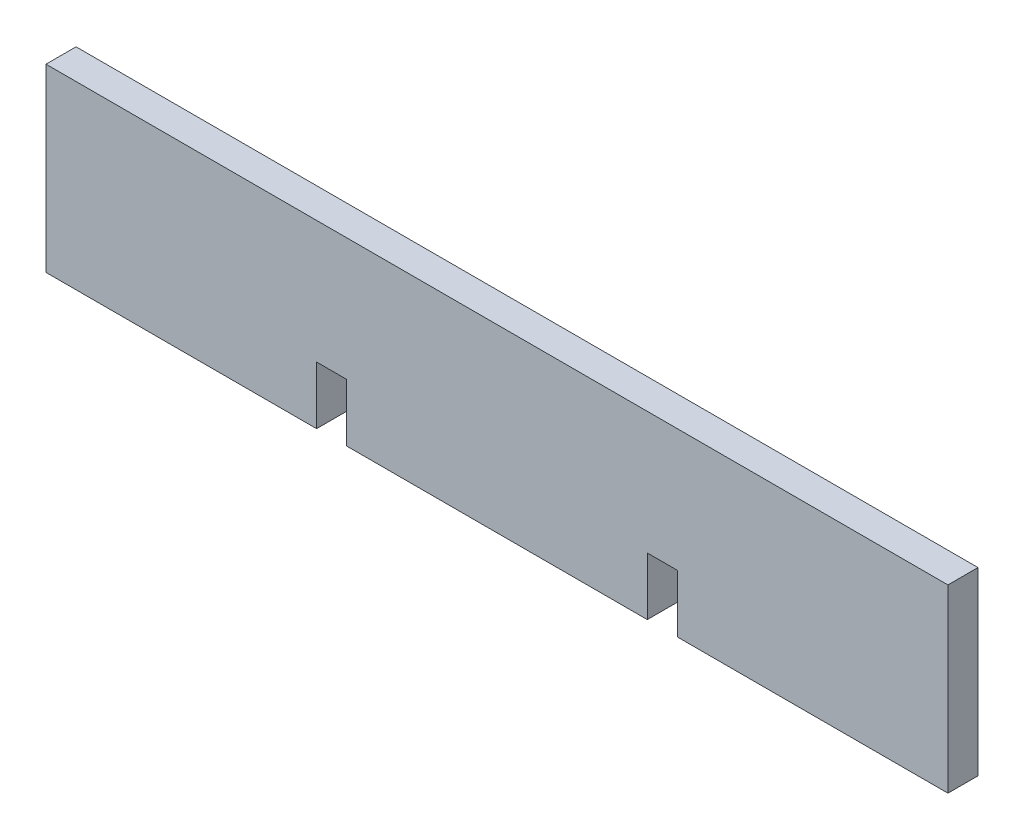
ISO-10303-21;
HEADER;
FILE_DESCRIPTION(('STEP AP214'),'2;1');
FILE_NAME('part.step','',(''),(''),'','','');
FILE_SCHEMA(('AUTOMOTIVE_DESIGN { 1 0 10303 214 1 1 1 1 }'));
ENDSEC;
DATA;
#1=APPLICATION_CONTEXT('core data for automotive mechanical design processes');
#2=APPLICATION_PROTOCOL_DEFINITION('international standard','automotive_design',2000,#1);
#3=PRODUCT_CONTEXT('',#1,'mechanical');
#4=PRODUCT('Part','Part','',(#3));
#5=PRODUCT_RELATED_PRODUCT_CATEGORY('part','',(#4));
#6=PRODUCT_DEFINITION_FORMATION('','',#4);
#7=PRODUCT_DEFINITION_CONTEXT('part definition',#1,'design');
#8=PRODUCT_DEFINITION('design','',#6,#7);
#9=PRODUCT_DEFINITION_SHAPE('','',#8);
#10=(LENGTH_UNIT() NAMED_UNIT(*) SI_UNIT(.MILLI.,.METRE.));
#11=(NAMED_UNIT(*) PLANE_ANGLE_UNIT() SI_UNIT($,.RADIAN.));
#12=(NAMED_UNIT(*) SI_UNIT($,.STERADIAN.) SOLID_ANGLE_UNIT());
#13=UNCERTAINTY_MEASURE_WITH_UNIT(LENGTH_MEASURE(1.E-05),#10,'distance_accuracy_value','');
#14=(GEOMETRIC_REPRESENTATION_CONTEXT(3) GLOBAL_UNCERTAINTY_ASSIGNED_CONTEXT((#13)) GLOBAL_UNIT_ASSIGNED_CONTEXT((#10,
#11,#12)) REPRESENTATION_CONTEXT('',''));
#15=CARTESIAN_POINT('',(0.,0.,0.));
#16=DIRECTION('',(0.,0.,1.));
#17=DIRECTION('',(1.,0.,0.));
#18=AXIS2_PLACEMENT_3D('',#15,#16,#17);
#19=CARTESIAN_POINT('',(334.481177096897,-114.977779473199,10.));
#20=DIRECTION('',(0.,-1.,0.));
#21=DIRECTION('',(0.,0.,-1.));
#22=AXIS2_PLACEMENT_3D('',#19,#20,#21);
#23=PLANE('',#22);
#24=DIRECTION('',(-1.,0.,0.));
#25=VECTOR('',#24,1.);
#26=CARTESIAN_POINT('',(334.481177096897,-114.977779473199,0.));
#27=LINE('',#26,#25);
#28=CARTESIAN_POINT('',(334.481177096897,-114.977779473199,0.));
#29=VERTEX_POINT('',#28);
#30=CARTESIAN_POINT('',(34.4811855740017,-114.977779473199,0.));
#31=VERTEX_POINT('',#30);
#32=EDGE_CURVE('E163',#29,#31,#27,.T.);
#33=ORIENTED_EDGE('',*,*,#32,.T.);
#34=DIRECTION('',(0.,0.,-1.));
#35=VECTOR('',#34,1.);
#36=CARTESIAN_POINT('',(34.4811855740017,-114.977779473199,10.));
#37=LINE('',#36,#35);
#38=CARTESIAN_POINT('',(34.4811855740017,-114.977779473199,10.));
#39=VERTEX_POINT('',#38);
#40=EDGE_CURVE('E11',#39,#31,#37,.T.);
#41=ORIENTED_EDGE('',*,*,#40,.F.);
#42=DIRECTION('',(-1.,0.,0.));
#43=VECTOR('',#42,1.);
#44=CARTESIAN_POINT('',(334.481177096897,-114.977779473199,10.));
#45=LINE('',#44,#43);
#46=CARTESIAN_POINT('',(334.481177096897,-114.977779473199,10.));
#47=VERTEX_POINT('',#46);
#48=EDGE_CURVE('E191',#47,#39,#45,.T.);
#49=ORIENTED_EDGE('',*,*,#48,.F.);
#50=DIRECTION('',(0.,0.,-1.));
#51=VECTOR('',#50,1.);
#52=CARTESIAN_POINT('',(334.481177096897,-114.977779473199,10.));
#53=LINE('',#52,#51);
#54=EDGE_CURVE('E159',#47,#29,#53,.T.);
#55=ORIENTED_EDGE('',*,*,#54,.T.);
#56=EDGE_LOOP('',(#33,#41,#49,#55));
#57=FACE_BOUND('',#56,.T.);
#58=ADVANCED_FACE('F32',(#57),#23,.F.);
#59=CARTESIAN_POINT('',(34.4811855740017,-114.977779473199,10.));
#60=DIRECTION('',(1.,0.,0.));
#61=DIRECTION('',(0.,0.,-1.));
#62=AXIS2_PLACEMENT_3D('',#59,#60,#61);
#63=PLANE('',#62);
#64=DIRECTION('',(0.,-1.,0.));
#65=VECTOR('',#64,1.);
#66=CARTESIAN_POINT('',(34.4811855740017,-114.977779473199,0.));
#67=LINE('',#66,#65);
#68=CARTESIAN_POINT('',(34.4811855740017,-174.977777777778,0.));
#69=VERTEX_POINT('',#68);
#70=EDGE_CURVE('E166',#31,#69,#67,.T.);
#71=ORIENTED_EDGE('',*,*,#70,.T.);
#72=DIRECTION('',(0.,0.,-1.));
#73=VECTOR('',#72,1.);
#74=CARTESIAN_POINT('',(34.4811855740017,-174.977777777778,10.));
#75=LINE('',#74,#73);
#76=CARTESIAN_POINT('',(34.4811855740017,-174.977777777778,10.));
#77=VERTEX_POINT('',#76);
#78=EDGE_CURVE('E39',#77,#69,#75,.T.);
#79=ORIENTED_EDGE('',*,*,#78,.F.);
#80=DIRECTION('',(0.,-1.,0.));
#81=VECTOR('',#80,1.);
#82=CARTESIAN_POINT('',(34.4811855740017,-114.977779473199,10.));
#83=LINE('',#82,#81);
#84=EDGE_CURVE('E108',#39,#77,#83,.T.);
#85=ORIENTED_EDGE('',*,*,#84,.F.);
#86=ORIENTED_EDGE('',*,*,#40,.T.);
#87=EDGE_LOOP('',(#71,#79,#85,#86));
#88=FACE_BOUND('',#87,.T.);
#89=ADVANCED_FACE('F328',(#88),#63,.F.);
#90=CARTESIAN_POINT('',(34.4811855740017,-174.977777777778,10.));
#91=DIRECTION('',(0.,1.,0.));
#92=DIRECTION('',(0.,0.,1.));
#93=AXIS2_PLACEMENT_3D('',#90,#91,#92);
#94=PLANE('',#93);
#95=DIRECTION('',(1.,0.,0.));
#96=VECTOR('',#95,1.);
#97=CARTESIAN_POINT('',(34.4811855740017,-174.977777777778,0.));
#98=LINE('',#97,#96);
#99=CARTESIAN_POINT('',(124.48118303087,-174.977777777778,0.));
#100=VERTEX_POINT('',#99);
#101=EDGE_CURVE('E169',#69,#100,#98,.T.);
#102=ORIENTED_EDGE('',*,*,#101,.T.);
#103=DIRECTION('',(0.,0.,-1.));
#104=VECTOR('',#103,1.);
#105=CARTESIAN_POINT('',(124.48118303087,-174.977777777778,10.));
#106=LINE('',#105,#104);
#107=CARTESIAN_POINT('',(124.48118303087,-174.977777777778,10.));
#108=VERTEX_POINT('',#107);
#109=EDGE_CURVE('E210',#108,#100,#106,.T.);
#110=ORIENTED_EDGE('',*,*,#109,.F.);
#111=DIRECTION('',(1.,0.,0.));
#112=VECTOR('',#111,1.);
#113=CARTESIAN_POINT('',(34.4811855740017,-174.977777777778,10.));
#114=LINE('',#113,#112);
#115=EDGE_CURVE('E218',#77,#108,#114,.T.);
#116=ORIENTED_EDGE('',*,*,#115,.F.);
#117=ORIENTED_EDGE('',*,*,#78,.T.);
#118=EDGE_LOOP('',(#102,#110,#116,#117));
#119=FACE_BOUND('',#118,.T.);
#120=ADVANCED_FACE('F216',(#119),#94,.F.);
#121=CARTESIAN_POINT('',(124.48118303087,-164.97778523763,10.));
#122=DIRECTION('',(-1.,0.,0.));
#123=DIRECTION('',(0.,0.,1.));
#124=AXIS2_PLACEMENT_3D('',#121,#122,#123);
#125=PLANE('',#124);
#126=DIRECTION('',(0.,1.,0.));
#127=VECTOR('',#126,1.);
#128=CARTESIAN_POINT('',(124.48118303087,-164.97778523763,0.));
#129=LINE('',#128,#127);
#130=CARTESIAN_POINT('',(124.48118303087,-155.77638736301,0.));
#131=VERTEX_POINT('',#130);
#132=EDGE_CURVE('E172',#100,#131,#129,.T.);
#133=ORIENTED_EDGE('',*,*,#132,.T.);
#134=DIRECTION('',(0.,0.,-1.));
#135=VECTOR('',#134,1.);
#136=CARTESIAN_POINT('',(124.48118303087,-155.77638736301,10.));
#137=LINE('',#136,#135);
#138=CARTESIAN_POINT('',(124.48118303087,-155.77638736301,10.));
#139=VERTEX_POINT('',#138);
#140=EDGE_CURVE('E207',#139,#131,#137,.T.);
#141=ORIENTED_EDGE('',*,*,#140,.F.);
#142=DIRECTION('',(0.,1.,0.));
#143=VECTOR('',#142,1.);
#144=CARTESIAN_POINT('',(124.48118303087,-174.977777777778,10.));
#145=LINE('',#144,#143);
#146=EDGE_CURVE('E234',#108,#139,#145,.T.);
#147=ORIENTED_EDGE('',*,*,#146,.F.);
#148=ORIENTED_EDGE('',*,*,#109,.T.);
#149=EDGE_LOOP('',(#133,#141,#147,#148));
#150=FACE_BOUND('',#149,.T.);
#151=ADVANCED_FACE('F225',(#150),#125,.F.);
#152=CARTESIAN_POINT('',(124.48118303087,-155.77638736301,10.));
#153=DIRECTION('',(0.,1.,0.));
#154=DIRECTION('',(0.,0.,1.));
#155=AXIS2_PLACEMENT_3D('',#152,#153,#154);
#156=PLANE('',#155);
#157=DIRECTION('',(1.,0.,0.));
#158=VECTOR('',#157,1.);
#159=CARTESIAN_POINT('',(124.48118303087,-155.77638736301,0.));
#160=LINE('',#159,#158);
#161=CARTESIAN_POINT('',(134.481175571018,-155.77638736301,0.));
#162=VERTEX_POINT('',#161);
#163=EDGE_CURVE('E174',#131,#162,#160,.T.);
#164=ORIENTED_EDGE('',*,*,#163,.T.);
#165=DIRECTION('',(0.,0.,-1.));
#166=VECTOR('',#165,1.);
#167=CARTESIAN_POINT('',(134.481175571018,-155.77638736301,10.));
#168=LINE('',#167,#166);
#169=CARTESIAN_POINT('',(134.481175571018,-155.77638736301,10.));
#170=VERTEX_POINT('',#169);
#171=EDGE_CURVE('E204',#170,#162,#168,.T.);
#172=ORIENTED_EDGE('',*,*,#171,.F.);
#173=DIRECTION('',(1.,0.,0.));
#174=VECTOR('',#173,1.);
#175=CARTESIAN_POINT('',(124.48118303087,-155.77638736301,10.));
#176=LINE('',#175,#174);
#177=EDGE_CURVE('E231',#139,#170,#176,.T.);
#178=ORIENTED_EDGE('',*,*,#177,.F.);
#179=ORIENTED_EDGE('',*,*,#140,.T.);
#180=EDGE_LOOP('',(#164,#172,#178,#179));
#181=FACE_BOUND('',#180,.T.);
#182=ADVANCED_FACE('F229',(#181),#156,.F.);
#183=CARTESIAN_POINT('',(134.481175571018,-164.97778523763,10.));
#184=DIRECTION('',(1.,0.,0.));
#185=DIRECTION('',(0.,0.,-1.));
#186=AXIS2_PLACEMENT_3D('',#183,#184,#185);
#187=PLANE('',#186);
#188=DIRECTION('',(0.,-1.,0.));
#189=VECTOR('',#188,1.);
#190=CARTESIAN_POINT('',(134.481175571018,-164.97778523763,0.));
#191=LINE('',#190,#189);
#192=CARTESIAN_POINT('',(134.481175571018,-174.977777777778,0.));
#193=VERTEX_POINT('',#192);
#194=EDGE_CURVE('E177',#162,#193,#191,.T.);
#195=ORIENTED_EDGE('',*,*,#194,.T.);
#196=DIRECTION('',(0.,0.,-1.));
#197=VECTOR('',#196,1.);
#198=CARTESIAN_POINT('',(134.481175571018,-174.977777777778,10.));
#199=LINE('',#198,#197);
#200=CARTESIAN_POINT('',(134.481175571018,-174.977777777778,10.));
#201=VERTEX_POINT('',#200);
#202=EDGE_CURVE('E201',#201,#193,#199,.T.);
#203=ORIENTED_EDGE('',*,*,#202,.F.);
#204=DIRECTION('',(0.,-1.,0.));
#205=VECTOR('',#204,1.);
#206=CARTESIAN_POINT('',(134.481175571018,-155.77638736301,10.));
#207=LINE('',#206,#205);
#208=EDGE_CURVE('E233',#170,#201,#207,.T.);
#209=ORIENTED_EDGE('',*,*,#208,.F.);
#210=ORIENTED_EDGE('',*,*,#171,.T.);
#211=EDGE_LOOP('',(#195,#203,#209,#210));
#212=FACE_BOUND('',#211,.T.);
#213=ADVANCED_FACE('F318',(#212),#187,.F.);
#214=CARTESIAN_POINT('',(134.481175571018,-174.977777777778,10.));
#215=DIRECTION('',(0.,1.,0.));
#216=DIRECTION('',(0.,0.,1.));
#217=AXIS2_PLACEMENT_3D('',#214,#215,#216);
#218=PLANE('',#217);
#219=DIRECTION('',(1.,0.,0.));
#220=VECTOR('',#219,1.);
#221=CARTESIAN_POINT('',(134.481175571018,-174.977777777778,10.));
#222=LINE('',#221,#220);
#223=CARTESIAN_POINT('',(184.581181335449,-174.977777777778,10.));
#224=VERTEX_POINT('',#223);
#225=CARTESIAN_POINT('',(234.481187099881,-174.977777777778,10.));
#226=VERTEX_POINT('',#225);
#227=EDGE_CURVE('E236',#224,#226,#222,.T.);
#228=ORIENTED_EDGE('',*,*,#227,.F.);
#229=DIRECTION('',(0.,0.,1.));
#230=VECTOR('',#229,1.);
#231=CARTESIAN_POINT('',(184.581181335449,-174.977777777778,9.99));
#232=LINE('',#231,#230);
#233=CARTESIAN_POINT('',(184.581181335449,-174.977777777778,9.99));
#234=VERTEX_POINT('',#233);
#235=EDGE_CURVE('E167',#234,#224,#232,.T.);
#236=ORIENTED_EDGE('',*,*,#235,.F.);
#237=DIRECTION('',(1.,0.,0.));
#238=VECTOR('',#237,1.);
#239=CARTESIAN_POINT('',(184.581181335449,-174.977777777778,9.99));
#240=LINE('',#239,#238);
#241=CARTESIAN_POINT('',(184.481181335449,-174.977777777778,9.99));
#242=VERTEX_POINT('',#241);
#243=EDGE_CURVE('E265',#242,#234,#240,.T.);
#244=ORIENTED_EDGE('',*,*,#243,.F.);
#245=DIRECTION('',(0.,0.,1.));
#246=VECTOR('',#245,1.);
#247=CARTESIAN_POINT('',(184.481181335449,-174.977777777778,9.99));
#248=LINE('',#247,#246);
#249=CARTESIAN_POINT('',(184.481181335449,-174.977777777778,10.));
#250=VERTEX_POINT('',#249);
#251=EDGE_CURVE('E268',#242,#250,#248,.T.);
#252=ORIENTED_EDGE('',*,*,#251,.T.);
#253=EDGE_CURVE('E241',#201,#250,#222,.T.);
#254=ORIENTED_EDGE('',*,*,#253,.F.);
#255=ORIENTED_EDGE('',*,*,#202,.T.);
#256=DIRECTION('',(1.,0.,0.));
#257=VECTOR('',#256,1.);
#258=CARTESIAN_POINT('',(134.481175571018,-174.977777777778,0.));
#259=LINE('',#258,#257);
#260=CARTESIAN_POINT('',(234.481187099881,-174.977777777778,0.));
#261=VERTEX_POINT('',#260);
#262=EDGE_CURVE('E179',#193,#261,#259,.T.);
#263=ORIENTED_EDGE('',*,*,#262,.T.);
#264=DIRECTION('',(0.,0.,-1.));
#265=VECTOR('',#264,1.);
#266=CARTESIAN_POINT('',(234.481187099881,-174.977777777778,10.));
#267=LINE('',#266,#265);
#268=EDGE_CURVE('E198',#226,#261,#267,.T.);
#269=ORIENTED_EDGE('',*,*,#268,.F.);
#270=EDGE_LOOP('',(#228,#236,#244,#252,#254,#255,#263,#269));
#271=FACE_BOUND('',#270,.T.);
#272=ADVANCED_FACE('F315',(#271),#218,.F.);
#273=CARTESIAN_POINT('',(234.481187099881,-164.97778523763,10.));
#274=DIRECTION('',(-1.,0.,0.));
#275=DIRECTION('',(0.,0.,1.));
#276=AXIS2_PLACEMENT_3D('',#273,#274,#275);
#277=PLANE('',#276);
#278=DIRECTION('',(0.,1.,0.));
#279=VECTOR('',#278,1.);
#280=CARTESIAN_POINT('',(234.481187099881,-164.97778523763,0.));
#281=LINE('',#280,#279);
#282=CARTESIAN_POINT('',(234.481187099881,-155.77638736301,0.));
#283=VERTEX_POINT('',#282);
#284=EDGE_CURVE('E182',#261,#283,#281,.T.);
#285=ORIENTED_EDGE('',*,*,#284,.T.);
#286=DIRECTION('',(0.,0.,-1.));
#287=VECTOR('',#286,1.);
#288=CARTESIAN_POINT('',(234.481187099881,-155.77638736301,10.));
#289=LINE('',#288,#287);
#290=CARTESIAN_POINT('',(234.481187099881,-155.77638736301,10.));
#291=VERTEX_POINT('',#290);
#292=EDGE_CURVE('E195',#291,#283,#289,.T.);
#293=ORIENTED_EDGE('',*,*,#292,.F.);
#294=DIRECTION('',(0.,1.,0.));
#295=VECTOR('',#294,1.);
#296=CARTESIAN_POINT('',(234.481187099881,-174.977777777778,10.));
#297=LINE('',#296,#295);
#298=EDGE_CURVE('E244',#226,#291,#297,.T.);
#299=ORIENTED_EDGE('',*,*,#298,.F.);
#300=ORIENTED_EDGE('',*,*,#268,.T.);
#301=EDGE_LOOP('',(#285,#293,#299,#300));
#302=FACE_BOUND('',#301,.T.);
#303=ADVANCED_FACE('F250',(#302),#277,.F.);
#304=CARTESIAN_POINT('',(234.481187099881,-155.77638736301,10.));
#305=DIRECTION('',(0.,1.,0.));
#306=DIRECTION('',(0.,0.,1.));
#307=AXIS2_PLACEMENT_3D('',#304,#305,#306);
#308=PLANE('',#307);
#309=DIRECTION('',(1.,0.,0.));
#310=VECTOR('',#309,1.);
#311=CARTESIAN_POINT('',(234.481187099881,-155.77638736301,0.));
#312=LINE('',#311,#310);
#313=CARTESIAN_POINT('',(244.481179640028,-155.77638736301,0.));
#314=VERTEX_POINT('',#313);
#315=EDGE_CURVE('E184',#283,#314,#312,.T.);
#316=ORIENTED_EDGE('',*,*,#315,.T.);
#317=DIRECTION('',(0.,0.,-1.));
#318=VECTOR('',#317,1.);
#319=CARTESIAN_POINT('',(244.481179640028,-155.77638736301,10.));
#320=LINE('',#319,#318);
#321=CARTESIAN_POINT('',(244.481179640028,-155.77638736301,10.));
#322=VERTEX_POINT('',#321);
#323=EDGE_CURVE('E154',#322,#314,#320,.T.);
#324=ORIENTED_EDGE('',*,*,#323,.F.);
#325=DIRECTION('',(1.,0.,0.));
#326=VECTOR('',#325,1.);
#327=CARTESIAN_POINT('',(234.481187099881,-155.77638736301,10.));
#328=LINE('',#327,#326);
#329=EDGE_CURVE('E143',#291,#322,#328,.T.);
#330=ORIENTED_EDGE('',*,*,#329,.F.);
#331=ORIENTED_EDGE('',*,*,#292,.T.);
#332=EDGE_LOOP('',(#316,#324,#330,#331));
#333=FACE_BOUND('',#332,.T.);
#334=ADVANCED_FACE('F253',(#333),#308,.F.);
#335=CARTESIAN_POINT('',(244.481179640028,-164.97778523763,10.));
#336=DIRECTION('',(1.,0.,0.));
#337=DIRECTION('',(0.,0.,-1.));
#338=AXIS2_PLACEMENT_3D('',#335,#336,#337);
#339=PLANE('',#338);
#340=DIRECTION('',(0.,-1.,0.));
#341=VECTOR('',#340,1.);
#342=CARTESIAN_POINT('',(244.481179640028,-164.97778523763,0.));
#343=LINE('',#342,#341);
#344=CARTESIAN_POINT('',(244.481179640028,-174.977777777778,0.));
#345=VERTEX_POINT('',#344);
#346=EDGE_CURVE('E151',#314,#345,#343,.T.);
#347=ORIENTED_EDGE('',*,*,#346,.T.);
#348=DIRECTION('',(0.,0.,-1.));
#349=VECTOR('',#348,1.);
#350=CARTESIAN_POINT('',(244.481179640028,-174.977777777778,10.));
#351=LINE('',#350,#349);
#352=CARTESIAN_POINT('',(244.481179640028,-174.977777777778,10.));
#353=VERTEX_POINT('',#352);
#354=EDGE_CURVE('E149',#353,#345,#351,.T.);
#355=ORIENTED_EDGE('',*,*,#354,.F.);
#356=DIRECTION('',(0.,-1.,0.));
#357=VECTOR('',#356,1.);
#358=CARTESIAN_POINT('',(244.481179640028,-155.77638736301,10.));
#359=LINE('',#358,#357);
#360=EDGE_CURVE('E136',#322,#353,#359,.T.);
#361=ORIENTED_EDGE('',*,*,#360,.F.);
#362=ORIENTED_EDGE('',*,*,#323,.T.);
#363=EDGE_LOOP('',(#347,#355,#361,#362));
#364=FACE_BOUND('',#363,.T.);
#365=ADVANCED_FACE('F150',(#364),#339,.F.);
#366=CARTESIAN_POINT('',(244.481179640028,-174.977777777778,10.));
#367=DIRECTION('',(0.,1.,0.));
#368=DIRECTION('',(0.,0.,1.));
#369=AXIS2_PLACEMENT_3D('',#366,#367,#368);
#370=PLANE('',#369);
#371=DIRECTION('',(1.,0.,0.));
#372=VECTOR('',#371,1.);
#373=CARTESIAN_POINT('',(244.481179640028,-174.977777777778,0.));
#374=LINE('',#373,#372);
#375=CARTESIAN_POINT('',(334.481177096897,-174.977777777778,0.));
#376=VERTEX_POINT('',#375);
#377=EDGE_CURVE('E188',#345,#376,#374,.T.);
#378=ORIENTED_EDGE('',*,*,#377,.T.);
#379=DIRECTION('',(0.,0.,-1.));
#380=VECTOR('',#379,1.);
#381=CARTESIAN_POINT('',(334.481177096897,-174.977777777778,10.));
#382=LINE('',#381,#380);
#383=CARTESIAN_POINT('',(334.481177096897,-174.977777777778,10.));
#384=VERTEX_POINT('',#383);
#385=EDGE_CURVE('E155',#384,#376,#382,.T.);
#386=ORIENTED_EDGE('',*,*,#385,.F.);
#387=DIRECTION('',(1.,0.,0.));
#388=VECTOR('',#387,1.);
#389=CARTESIAN_POINT('',(244.481179640028,-174.977777777778,10.));
#390=LINE('',#389,#388);
#391=EDGE_CURVE('E140',#353,#384,#390,.T.);
#392=ORIENTED_EDGE('',*,*,#391,.F.);
#393=ORIENTED_EDGE('',*,*,#354,.T.);
#394=EDGE_LOOP('',(#378,#386,#392,#393));
#395=FACE_BOUND('',#394,.T.);
#396=ADVANCED_FACE('F157',(#395),#370,.F.);
#397=CARTESIAN_POINT('',(334.481177096897,-174.977777777778,10.));
#398=DIRECTION('',(-1.,0.,0.));
#399=DIRECTION('',(0.,0.,1.));
#400=AXIS2_PLACEMENT_3D('',#397,#398,#399);
#401=PLANE('',#400);
#402=DIRECTION('',(0.,1.,0.));
#403=VECTOR('',#402,1.);
#404=CARTESIAN_POINT('',(334.481177096897,-174.977777777778,0.));
#405=LINE('',#404,#403);
#406=EDGE_CURVE('E100',#376,#29,#405,.T.);
#407=ORIENTED_EDGE('',*,*,#406,.T.);
#408=ORIENTED_EDGE('',*,*,#54,.F.);
#409=DIRECTION('',(0.,1.,0.));
#410=VECTOR('',#409,1.);
#411=CARTESIAN_POINT('',(334.481177096897,-174.977777777778,10.));
#412=LINE('',#411,#410);
#413=EDGE_CURVE('E55',#384,#47,#412,.T.);
#414=ORIENTED_EDGE('',*,*,#413,.F.);
#415=ORIENTED_EDGE('',*,*,#385,.T.);
#416=EDGE_LOOP('',(#407,#408,#414,#415));
#417=FACE_BOUND('',#416,.T.);
#418=ADVANCED_FACE('F255',(#417),#401,.F.);
#419=CARTESIAN_POINT('',(0.,0.,10.));
#420=DIRECTION('',(0.,0.,1.));
#421=DIRECTION('',(1.,0.,0.));
#422=AXIS2_PLACEMENT_3D('',#419,#420,#421);
#423=PLANE('',#422);
#424=DIRECTION('',(0.,1.,0.));
#425=VECTOR('',#424,1.);
#426=CARTESIAN_POINT('',(184.581181335449,-174.977777777778,10.));
#427=LINE('',#426,#425);
#428=CARTESIAN_POINT('',(184.581181335449,-174.877777777778,10.));
#429=VERTEX_POINT('',#428);
#430=EDGE_CURVE('E46',#224,#429,#427,.T.);
#431=ORIENTED_EDGE('',*,*,#430,.F.);
#432=ORIENTED_EDGE('',*,*,#227,.T.);
#433=ORIENTED_EDGE('',*,*,#298,.T.);
#434=ORIENTED_EDGE('',*,*,#329,.T.);
#435=ORIENTED_EDGE('',*,*,#360,.T.);
#436=ORIENTED_EDGE('',*,*,#391,.T.);
#437=ORIENTED_EDGE('',*,*,#413,.T.);
#438=ORIENTED_EDGE('',*,*,#48,.T.);
#439=ORIENTED_EDGE('',*,*,#84,.T.);
#440=ORIENTED_EDGE('',*,*,#115,.T.);
#441=ORIENTED_EDGE('',*,*,#146,.T.);
#442=ORIENTED_EDGE('',*,*,#177,.T.);
#443=ORIENTED_EDGE('',*,*,#208,.T.);
#444=ORIENTED_EDGE('',*,*,#253,.T.);
#445=DIRECTION('',(0.,-1.,0.));
#446=VECTOR('',#445,1.);
#447=CARTESIAN_POINT('',(184.481181335449,-174.977777777778,10.));
#448=LINE('',#447,#446);
#449=CARTESIAN_POINT('',(184.481181335449,-174.877777777778,10.));
#450=VERTEX_POINT('',#449);
#451=EDGE_CURVE('E272',#450,#250,#448,.T.);
#452=ORIENTED_EDGE('',*,*,#451,.F.);
#453=DIRECTION('',(-1.,-2.7755575615632E-13,0.));
#454=VECTOR('',#453,1.);
#455=CARTESIAN_POINT('',(184.581181335449,-174.877777777778,10.));
#456=LINE('',#455,#454);
#457=EDGE_CURVE('E276',#429,#450,#456,.T.);
#458=ORIENTED_EDGE('',*,*,#457,.F.);
#459=EDGE_LOOP('',(#431,#432,#433,#434,#435,#436,#437,#438,#439,#440,#441,#442,#443,#444,#452,#458));
#460=FACE_BOUND('',#459,.T.);
#461=ADVANCED_FACE('F138',(#460),#423,.T.);
#462=CARTESIAN_POINT('',(0.,0.,0.));
#463=DIRECTION('',(0.,0.,1.));
#464=DIRECTION('',(1.,0.,0.));
#465=AXIS2_PLACEMENT_3D('',#462,#463,#464);
#466=PLANE('',#465);
#467=ORIENTED_EDGE('',*,*,#32,.F.);
#468=ORIENTED_EDGE('',*,*,#406,.F.);
#469=ORIENTED_EDGE('',*,*,#377,.F.);
#470=ORIENTED_EDGE('',*,*,#346,.F.);
#471=ORIENTED_EDGE('',*,*,#315,.F.);
#472=ORIENTED_EDGE('',*,*,#284,.F.);
#473=ORIENTED_EDGE('',*,*,#262,.F.);
#474=ORIENTED_EDGE('',*,*,#194,.F.);
#475=ORIENTED_EDGE('',*,*,#163,.F.);
#476=ORIENTED_EDGE('',*,*,#132,.F.);
#477=ORIENTED_EDGE('',*,*,#101,.F.);
#478=ORIENTED_EDGE('',*,*,#70,.F.);
#479=EDGE_LOOP('',(#467,#468,#469,#470,#471,#472,#473,#474,#475,#476,#477,#478));
#480=FACE_BOUND('',#479,.T.);
#481=ADVANCED_FACE('F221',(#480),#466,.F.);
#482=CARTESIAN_POINT('',(184.581181335449,-174.977777777778,9.99));
#483=DIRECTION('',(1.,0.,0.));
#484=DIRECTION('',(0.,0.,-1.));
#485=AXIS2_PLACEMENT_3D('',#482,#483,#484);
#486=PLANE('',#485);
#487=ORIENTED_EDGE('',*,*,#430,.T.);
#488=DIRECTION('',(0.,0.,1.));
#489=VECTOR('',#488,1.);
#490=CARTESIAN_POINT('',(184.581181335449,-174.877777777778,9.99));
#491=LINE('',#490,#489);
#492=CARTESIAN_POINT('',(184.581181335449,-174.877777777778,9.99));
#493=VERTEX_POINT('',#492);
#494=EDGE_CURVE('E262',#493,#429,#491,.T.);
#495=ORIENTED_EDGE('',*,*,#494,.F.);
#496=DIRECTION('',(0.,1.,0.));
#497=VECTOR('',#496,1.);
#498=CARTESIAN_POINT('',(184.581181335449,-174.977777777778,9.99));
#499=LINE('',#498,#497);
#500=EDGE_CURVE('E275',#234,#493,#499,.T.);
#501=ORIENTED_EDGE('',*,*,#500,.F.);
#502=ORIENTED_EDGE('',*,*,#235,.T.);
#503=EDGE_LOOP('',(#487,#495,#501,#502));
#504=FACE_BOUND('',#503,.T.);
#505=ADVANCED_FACE('F298',(#504),#486,.F.);
#506=CARTESIAN_POINT('',(184.481181335449,-174.977777777778,9.99));
#507=DIRECTION('',(-1.,0.,0.));
#508=DIRECTION('',(0.,0.,1.));
#509=AXIS2_PLACEMENT_3D('',#506,#507,#508);
#510=PLANE('',#509);
#511=ORIENTED_EDGE('',*,*,#451,.T.);
#512=ORIENTED_EDGE('',*,*,#251,.F.);
#513=DIRECTION('',(0.,-1.,0.));
#514=VECTOR('',#513,1.);
#515=CARTESIAN_POINT('',(184.481181335449,-174.977777777778,9.99));
#516=LINE('',#515,#514);
#517=CARTESIAN_POINT('',(184.481181335449,-174.877777777778,9.99));
#518=VERTEX_POINT('',#517);
#519=EDGE_CURVE('E282',#518,#242,#516,.T.);
#520=ORIENTED_EDGE('',*,*,#519,.F.);
#521=DIRECTION('',(0.,0.,1.));
#522=VECTOR('',#521,1.);
#523=CARTESIAN_POINT('',(184.481181335449,-174.877777777778,9.99));
#524=LINE('',#523,#522);
#525=EDGE_CURVE('E264',#518,#450,#524,.T.);
#526=ORIENTED_EDGE('',*,*,#525,.T.);
#527=EDGE_LOOP('',(#511,#512,#520,#526));
#528=FACE_BOUND('',#527,.T.);
#529=ADVANCED_FACE('F309',(#528),#510,.F.);
#530=CARTESIAN_POINT('',(184.581181335449,-174.877777777778,9.99));
#531=DIRECTION('',(-2.7755575615632E-13,1.,0.));
#532=DIRECTION('',(-1.,-2.7755575615632E-13,0.));
#533=AXIS2_PLACEMENT_3D('',#530,#531,#532);
#534=PLANE('',#533);
#535=ORIENTED_EDGE('',*,*,#457,.T.);
#536=ORIENTED_EDGE('',*,*,#525,.F.);
#537=DIRECTION('',(-1.,-2.7755575615632E-13,0.));
#538=VECTOR('',#537,1.);
#539=CARTESIAN_POINT('',(184.581181335449,-174.877777777778,9.99));
#540=LINE('',#539,#538);
#541=EDGE_CURVE('E285',#493,#518,#540,.T.);
#542=ORIENTED_EDGE('',*,*,#541,.F.);
#543=ORIENTED_EDGE('',*,*,#494,.T.);
#544=EDGE_LOOP('',(#535,#536,#542,#543));
#545=FACE_BOUND('',#544,.T.);
#546=ADVANCED_FACE('F432',(#545),#534,.F.);
#547=CARTESIAN_POINT('',(0.,0.,9.99));
#548=DIRECTION('',(0.,0.,1.));
#549=DIRECTION('',(1.,0.,0.));
#550=AXIS2_PLACEMENT_3D('',#547,#548,#549);
#551=PLANE('',#550);
#552=ORIENTED_EDGE('',*,*,#500,.T.);
#553=ORIENTED_EDGE('',*,*,#541,.T.);
#554=ORIENTED_EDGE('',*,*,#519,.T.);
#555=ORIENTED_EDGE('',*,*,#243,.T.);
#556=EDGE_LOOP('',(#552,#553,#554,#555));
#557=FACE_BOUND('',#556,.T.);
#558=ADVANCED_FACE('F292',(#557),#551,.T.);
#559=CLOSED_SHELL('',(#58,#89,#120,#151,#182,#213,#272,#303,#334,#365,#396,#418,#461,#481,#505,
#529,#546,#558));
#560=MANIFOLD_SOLID_BREP('B2',#559);
#561=ADVANCED_BREP_SHAPE_REPRESENTATION('',(#18,#560),#14);
#562=SHAPE_DEFINITION_REPRESENTATION(#9,#561);
ENDSEC;
END-ISO-10303-21;
